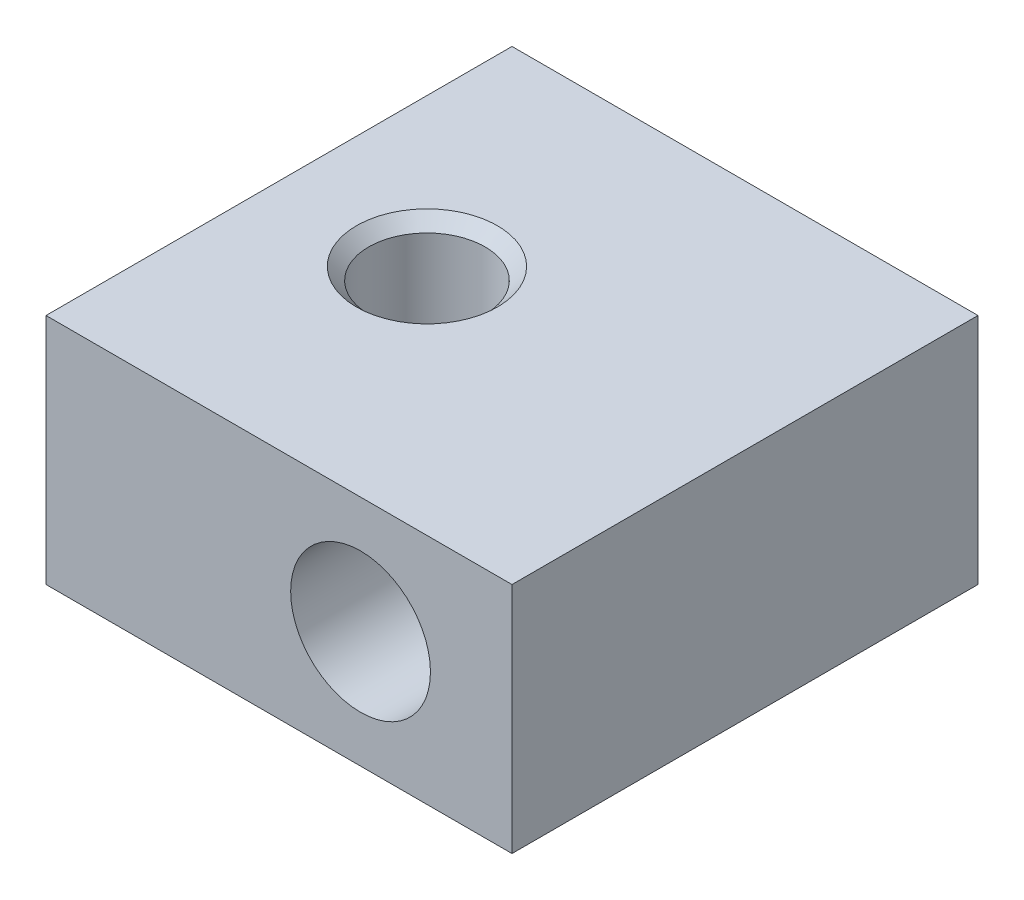
ISO-10303-21;
HEADER;
FILE_DESCRIPTION(('STEP AP214'),'2;1');
FILE_NAME('part.step','',(''),(''),'','','');
FILE_SCHEMA(('AUTOMOTIVE_DESIGN { 1 0 10303 214 1 1 1 1 }'));
ENDSEC;
DATA;
#1=APPLICATION_CONTEXT('core data for automotive mechanical design processes');
#2=APPLICATION_PROTOCOL_DEFINITION('international standard','automotive_design',2000,#1);
#3=PRODUCT_CONTEXT('',#1,'mechanical');
#4=PRODUCT('Part','Part','',(#3));
#5=PRODUCT_RELATED_PRODUCT_CATEGORY('part','',(#4));
#6=PRODUCT_DEFINITION_FORMATION('','',#4);
#7=PRODUCT_DEFINITION_CONTEXT('part definition',#1,'design');
#8=PRODUCT_DEFINITION('design','',#6,#7);
#9=PRODUCT_DEFINITION_SHAPE('','',#8);
#10=(LENGTH_UNIT() NAMED_UNIT(*) SI_UNIT(.MILLI.,.METRE.));
#11=(NAMED_UNIT(*) PLANE_ANGLE_UNIT() SI_UNIT($,.RADIAN.));
#12=(NAMED_UNIT(*) SI_UNIT($,.STERADIAN.) SOLID_ANGLE_UNIT());
#13=UNCERTAINTY_MEASURE_WITH_UNIT(LENGTH_MEASURE(1.E-05),#10,'distance_accuracy_value','');
#14=(GEOMETRIC_REPRESENTATION_CONTEXT(3) GLOBAL_UNCERTAINTY_ASSIGNED_CONTEXT((#13)) GLOBAL_UNIT_ASSIGNED_CONTEXT((#10,
#11,#12)) REPRESENTATION_CONTEXT('',''));
#15=CARTESIAN_POINT('',(0.,0.,0.));
#16=DIRECTION('',(0.,0.,1.));
#17=DIRECTION('',(1.,0.,0.));
#18=AXIS2_PLACEMENT_3D('',#15,#16,#17);
#19=CARTESIAN_POINT('',(-10.,5.,10.));
#20=DIRECTION('',(1.,0.,0.));
#21=DIRECTION('',(0.,0.,-1.));
#22=AXIS2_PLACEMENT_3D('',#19,#20,#21);
#23=PLANE('',#22);
#24=DIRECTION('',(0.,0.,1.));
#25=VECTOR('',#24,1.);
#26=CARTESIAN_POINT('',(-10.,-5.,10.));
#27=LINE('',#26,#25);
#28=CARTESIAN_POINT('',(-10.,-5.,-10.));
#29=VERTEX_POINT('',#28);
#30=CARTESIAN_POINT('',(-10.,-5.,10.));
#31=VERTEX_POINT('',#30);
#32=EDGE_CURVE('E116',#29,#31,#27,.T.);
#33=ORIENTED_EDGE('',*,*,#32,.T.);
#34=DIRECTION('',(0.,-1.,0.));
#35=VECTOR('',#34,1.);
#36=CARTESIAN_POINT('',(-10.,5.,10.));
#37=LINE('',#36,#35);
#38=CARTESIAN_POINT('',(-10.,5.,10.));
#39=VERTEX_POINT('',#38);
#40=EDGE_CURVE('E137',#39,#31,#37,.T.);
#41=ORIENTED_EDGE('',*,*,#40,.F.);
#42=DIRECTION('',(0.,0.,1.));
#43=VECTOR('',#42,1.);
#44=CARTESIAN_POINT('',(-10.,5.,10.));
#45=LINE('',#44,#43);
#46=CARTESIAN_POINT('',(-10.,5.,-10.));
#47=VERTEX_POINT('',#46);
#48=EDGE_CURVE('E117',#47,#39,#45,.T.);
#49=ORIENTED_EDGE('',*,*,#48,.F.);
#50=DIRECTION('',(0.,-1.,0.));
#51=VECTOR('',#50,1.);
#52=CARTESIAN_POINT('',(-10.,5.,-10.));
#53=LINE('',#52,#51);
#54=EDGE_CURVE('E123',#47,#29,#53,.T.);
#55=ORIENTED_EDGE('',*,*,#54,.T.);
#56=EDGE_LOOP('',(#33,#41,#49,#55));
#57=FACE_BOUND('',#56,.T.);
#58=ADVANCED_FACE('F17',(#57),#23,.F.);
#59=CARTESIAN_POINT('',(10.,5.,10.));
#60=DIRECTION('',(0.,0.,-1.));
#61=DIRECTION('',(-1.,0.,0.));
#62=AXIS2_PLACEMENT_3D('',#59,#60,#61);
#63=PLANE('',#62);
#64=CARTESIAN_POINT('',(3.5,0.,10.));
#65=DIRECTION('',(0.,0.,-1.));
#66=DIRECTION('',(-1.,0.,0.));
#67=AXIS2_PLACEMENT_3D('',#64,#65,#66);
#68=CIRCLE('',#67,3.);
#69=CARTESIAN_POINT('',(0.5,0.,10.));
#70=VERTEX_POINT('',#69);
#71=EDGE_CURVE('E104',#70,#70,#68,.T.);
#72=ORIENTED_EDGE('',*,*,#71,.T.);
#73=EDGE_LOOP('',(#72));
#74=FACE_BOUND('',#73,.T.);
#75=DIRECTION('',(1.,0.,0.));
#76=VECTOR('',#75,1.);
#77=CARTESIAN_POINT('',(10.,-5.,10.));
#78=LINE('',#77,#76);
#79=CARTESIAN_POINT('',(10.,-5.,10.));
#80=VERTEX_POINT('',#79);
#81=EDGE_CURVE('E126',#31,#80,#78,.T.);
#82=ORIENTED_EDGE('',*,*,#81,.T.);
#83=DIRECTION('',(0.,-1.,0.));
#84=VECTOR('',#83,1.);
#85=CARTESIAN_POINT('',(10.,5.,10.));
#86=LINE('',#85,#84);
#87=CARTESIAN_POINT('',(10.,5.,10.));
#88=VERTEX_POINT('',#87);
#89=EDGE_CURVE('E134',#88,#80,#86,.T.);
#90=ORIENTED_EDGE('',*,*,#89,.F.);
#91=DIRECTION('',(1.,0.,0.));
#92=VECTOR('',#91,1.);
#93=CARTESIAN_POINT('',(10.,5.,10.));
#94=LINE('',#93,#92);
#95=EDGE_CURVE('E69',#39,#88,#94,.T.);
#96=ORIENTED_EDGE('',*,*,#95,.F.);
#97=ORIENTED_EDGE('',*,*,#40,.T.);
#98=EDGE_LOOP('',(#82,#90,#96,#97));
#99=FACE_BOUND('',#98,.T.);
#100=ADVANCED_FACE('F154',(#74,#99),#63,.F.);
#101=CARTESIAN_POINT('',(10.,5.,10.));
#102=DIRECTION('',(-1.,0.,0.));
#103=DIRECTION('',(0.,0.,1.));
#104=AXIS2_PLACEMENT_3D('',#101,#102,#103);
#105=PLANE('',#104);
#106=DIRECTION('',(0.,0.,-1.));
#107=VECTOR('',#106,1.);
#108=CARTESIAN_POINT('',(10.,-5.,10.));
#109=LINE('',#108,#107);
#110=CARTESIAN_POINT('',(10.,-5.,-10.));
#111=VERTEX_POINT('',#110);
#112=EDGE_CURVE('E128',#80,#111,#109,.T.);
#113=ORIENTED_EDGE('',*,*,#112,.T.);
#114=DIRECTION('',(0.,-1.,0.));
#115=VECTOR('',#114,1.);
#116=CARTESIAN_POINT('',(10.,5.,-10.));
#117=LINE('',#116,#115);
#118=CARTESIAN_POINT('',(10.,5.,-10.));
#119=VERTEX_POINT('',#118);
#120=EDGE_CURVE('E132',#119,#111,#117,.T.);
#121=ORIENTED_EDGE('',*,*,#120,.F.);
#122=DIRECTION('',(0.,0.,-1.));
#123=VECTOR('',#122,1.);
#124=CARTESIAN_POINT('',(10.,5.,10.));
#125=LINE('',#124,#123);
#126=EDGE_CURVE('E120',#88,#119,#125,.T.);
#127=ORIENTED_EDGE('',*,*,#126,.F.);
#128=ORIENTED_EDGE('',*,*,#89,.T.);
#129=EDGE_LOOP('',(#113,#121,#127,#128));
#130=FACE_BOUND('',#129,.T.);
#131=ADVANCED_FACE('F158',(#130),#105,.F.);
#132=CARTESIAN_POINT('',(10.,5.,-10.));
#133=DIRECTION('',(0.,0.,1.));
#134=DIRECTION('',(1.,0.,0.));
#135=AXIS2_PLACEMENT_3D('',#132,#133,#134);
#136=PLANE('',#135);
#137=CARTESIAN_POINT('',(-6.5,-2.5,-10.));
#138=DIRECTION('',(0.,0.,1.));
#139=DIRECTION('',(1.,0.,0.));
#140=AXIS2_PLACEMENT_3D('',#137,#138,#139);
#141=CIRCLE('',#140,1.5);
#142=CARTESIAN_POINT('',(-5.,-2.5,-10.));
#143=VERTEX_POINT('',#142);
#144=EDGE_CURVE('E11',#143,#143,#141,.T.);
#145=ORIENTED_EDGE('',*,*,#144,.T.);
#146=EDGE_LOOP('',(#145));
#147=FACE_BOUND('',#146,.T.);
#148=CARTESIAN_POINT('',(-3.5,0.,-10.));
#149=DIRECTION('',(0.,0.,-1.));
#150=DIRECTION('',(-1.,0.,0.));
#151=AXIS2_PLACEMENT_3D('',#148,#149,#150);
#152=CIRCLE('',#151,1.525);
#153=CARTESIAN_POINT('',(-5.025,0.,-10.));
#154=VERTEX_POINT('',#153);
#155=EDGE_CURVE('E92',#154,#154,#152,.T.);
#156=ORIENTED_EDGE('',*,*,#155,.F.);
#157=EDGE_LOOP('',(#156));
#158=FACE_BOUND('',#157,.T.);
#159=CARTESIAN_POINT('',(3.5,0.,-10.));
#160=DIRECTION('',(0.,0.,1.));
#161=DIRECTION('',(1.,0.,0.));
#162=AXIS2_PLACEMENT_3D('',#159,#160,#161);
#163=CIRCLE('',#162,3.);
#164=CARTESIAN_POINT('',(6.5,0.,-10.));
#165=VERTEX_POINT('',#164);
#166=EDGE_CURVE('E101',#165,#165,#163,.T.);
#167=ORIENTED_EDGE('',*,*,#166,.T.);
#168=EDGE_LOOP('',(#167));
#169=FACE_BOUND('',#168,.T.);
#170=DIRECTION('',(-1.,0.,0.));
#171=VECTOR('',#170,1.);
#172=CARTESIAN_POINT('',(10.,-5.,-10.));
#173=LINE('',#172,#171);
#174=EDGE_CURVE('E61',#111,#29,#173,.T.);
#175=ORIENTED_EDGE('',*,*,#174,.T.);
#176=ORIENTED_EDGE('',*,*,#54,.F.);
#177=DIRECTION('',(-1.,0.,0.));
#178=VECTOR('',#177,1.);
#179=CARTESIAN_POINT('',(10.,5.,-10.));
#180=LINE('',#179,#178);
#181=EDGE_CURVE('E40',#119,#47,#180,.T.);
#182=ORIENTED_EDGE('',*,*,#181,.F.);
#183=ORIENTED_EDGE('',*,*,#120,.T.);
#184=EDGE_LOOP('',(#175,#176,#182,#183));
#185=FACE_BOUND('',#184,.T.);
#186=ADVANCED_FACE('F162',(#147,#158,#169,#185),#136,.F.);
#187=CARTESIAN_POINT('',(0.,5.,0.));
#188=DIRECTION('',(0.,1.,0.));
#189=DIRECTION('',(0.,0.,1.));
#190=AXIS2_PLACEMENT_3D('',#187,#188,#189);
#191=PLANE('',#190);
#192=CARTESIAN_POINT('',(-3.65,5.,0.));
#193=DIRECTION('',(0.,1.,0.));
#194=DIRECTION('',(0.,0.,1.));
#195=AXIS2_PLACEMENT_3D('',#192,#193,#194);
#196=CIRCLE('',#195,3.025);
#197=CARTESIAN_POINT('',(-3.65,5.,3.025));
#198=VERTEX_POINT('',#197);
#199=EDGE_CURVE('E107',#198,#198,#196,.T.);
#200=ORIENTED_EDGE('',*,*,#199,.F.);
#201=EDGE_LOOP('',(#200));
#202=FACE_BOUND('',#201,.T.);
#203=ORIENTED_EDGE('',*,*,#48,.T.);
#204=ORIENTED_EDGE('',*,*,#95,.T.);
#205=ORIENTED_EDGE('',*,*,#126,.T.);
#206=ORIENTED_EDGE('',*,*,#181,.T.);
#207=EDGE_LOOP('',(#203,#204,#205,#206));
#208=FACE_BOUND('',#207,.T.);
#209=ADVANCED_FACE('F166',(#202,#208),#191,.T.);
#210=CARTESIAN_POINT('',(0.,-5.,0.));
#211=DIRECTION('',(0.,1.,0.));
#212=DIRECTION('',(0.,0.,1.));
#213=AXIS2_PLACEMENT_3D('',#210,#211,#212);
#214=PLANE('',#213);
#215=CARTESIAN_POINT('',(3.5,-5.,0.));
#216=DIRECTION('',(0.,-1.,0.));
#217=DIRECTION('',(0.,0.,-1.));
#218=AXIS2_PLACEMENT_3D('',#215,#216,#217);
#219=CIRCLE('',#218,1.525);
#220=CARTESIAN_POINT('',(3.5,-5.,-1.525));
#221=VERTEX_POINT('',#220);
#222=EDGE_CURVE('E85',#221,#221,#219,.T.);
#223=ORIENTED_EDGE('',*,*,#222,.F.);
#224=EDGE_LOOP('',(#223));
#225=FACE_BOUND('',#224,.T.);
#226=CARTESIAN_POINT('',(-3.65,-5.,0.));
#227=DIRECTION('',(0.,1.,0.));
#228=DIRECTION('',(0.,0.,1.));
#229=AXIS2_PLACEMENT_3D('',#226,#227,#228);
#230=CIRCLE('',#229,2.5);
#231=CARTESIAN_POINT('',(-3.65,-5.,2.5));
#232=VERTEX_POINT('',#231);
#233=EDGE_CURVE('E113',#232,#232,#230,.T.);
#234=ORIENTED_EDGE('',*,*,#233,.T.);
#235=EDGE_LOOP('',(#234));
#236=FACE_BOUND('',#235,.T.);
#237=ORIENTED_EDGE('',*,*,#32,.F.);
#238=ORIENTED_EDGE('',*,*,#174,.F.);
#239=ORIENTED_EDGE('',*,*,#112,.F.);
#240=ORIENTED_EDGE('',*,*,#81,.F.);
#241=EDGE_LOOP('',(#237,#238,#239,#240));
#242=FACE_BOUND('',#241,.T.);
#243=ADVANCED_FACE('F168',(#225,#236,#242),#214,.F.);
#244=CARTESIAN_POINT('',(-3.65,5.,0.));
#245=DIRECTION('',(0.,1.,0.));
#246=DIRECTION('',(0.,0.,1.));
#247=AXIS2_PLACEMENT_3D('',#244,#245,#246);
#248=CYLINDRICAL_SURFACE('',#247,2.5);
#249=ORIENTED_EDGE('',*,*,#233,.F.);
#250=EDGE_LOOP('',(#249));
#251=FACE_BOUND('',#250,.T.);
#252=CARTESIAN_POINT('',(-3.65,4.475,0.));
#253=DIRECTION('',(0.,1.,0.));
#254=DIRECTION('',(0.,0.,1.));
#255=AXIS2_PLACEMENT_3D('',#252,#253,#254);
#256=CIRCLE('',#255,2.5);
#257=CARTESIAN_POINT('',(-3.65,4.475,2.5));
#258=VERTEX_POINT('',#257);
#259=EDGE_CURVE('E110',#258,#258,#256,.T.);
#260=ORIENTED_EDGE('',*,*,#259,.T.);
#261=EDGE_LOOP('',(#260));
#262=FACE_BOUND('',#261,.T.);
#263=ADVANCED_FACE('F171',(#251,#262),#248,.F.);
#264=CARTESIAN_POINT('',(-3.65,5.,0.));
#265=DIRECTION('',(0.,1.,0.));
#266=DIRECTION('',(0.,0.,1.));
#267=AXIS2_PLACEMENT_3D('',#264,#265,#266);
#268=CONICAL_SURFACE('',#267,3.025,0.785398163397448);
#269=ORIENTED_EDGE('',*,*,#259,.F.);
#270=EDGE_LOOP('',(#269));
#271=FACE_BOUND('',#270,.T.);
#272=ORIENTED_EDGE('',*,*,#199,.T.);
#273=EDGE_LOOP('',(#272));
#274=FACE_BOUND('',#273,.T.);
#275=ADVANCED_FACE('F177',(#271,#274),#268,.F.);
#276=CARTESIAN_POINT('',(3.5,0.,-10.));
#277=DIRECTION('',(0.,0.,1.));
#278=DIRECTION('',(1.,0.,0.));
#279=AXIS2_PLACEMENT_3D('',#276,#277,#278);
#280=CYLINDRICAL_SURFACE('',#279,3.);
#281=CARTESIAN_POINT('',(2.93902929634629,-2.94708534773474,-1.01754863024887));
#282=CARTESIAN_POINT('',(2.9778360711985,-2.95447222187118,-1.05298053926856));
#283=CARTESIAN_POINT('',(3.01938695038981,-2.96158871412183,-1.08556307139888));
#284=CARTESIAN_POINT('',(3.10761273509672,-2.97456074940779,-1.14330144718656));
#285=CARTESIAN_POINT('',(3.15428729096119,-2.98041637840655,-1.16845779719147));
#286=CARTESIAN_POINT('',(3.24167508543036,-2.9891096829254,-1.20519803350001));
#287=CARTESIAN_POINT('',(3.28161956267831,-2.99232129085835,-1.21851415452172));
#288=CARTESIAN_POINT('',(3.36322676214379,-2.99715830910277,-1.23844087267233));
#289=CARTESIAN_POINT('',(3.40488759593804,-2.99878541661862,-1.24505864489713));
#290=CARTESIAN_POINT('',(3.48888219520198,-3.00027410561686,-1.25111673260446));
#291=CARTESIAN_POINT('',(3.53121749172038,-3.00013083738701,-1.25053733235394));
#292=CARTESIAN_POINT('',(3.61513304261517,-2.99808402394393,-1.24219921613601));
#293=CARTESIAN_POINT('',(3.65671305429838,-2.99617992278466,-1.23443823273395));
#294=CARTESIAN_POINT('',(3.73660518678549,-2.99091472488166,-1.21267706898914));
#295=CARTESIAN_POINT('',(3.77497979996249,-2.98760358092684,-1.19889037371994));
#296=CARTESIAN_POINT('',(3.84920383108237,-2.9798409975681,-1.16594023589102));
#297=CARTESIAN_POINT('',(3.88505212026398,-2.97538905252149,-1.14677440875331));
#298=CARTESIAN_POINT('',(3.96795514299889,-2.96368351399748,-1.09508302399504));
#299=CARTESIAN_POINT('',(4.01355182189519,-2.95603086401605,-1.0603052290243));
#300=CARTESIAN_POINT('',(4.09841172060407,-2.9400302886856,-0.98384346727962));
#301=CARTESIAN_POINT('',(4.13766100752315,-2.93168089320182,-0.942144704173637));
#302=CARTESIAN_POINT('',(4.21969783319018,-2.91277659055338,-0.841248307860172));
#303=CARTESIAN_POINT('',(4.26046171194589,-2.90225036079277,-0.780400596432255));
#304=CARTESIAN_POINT('',(4.33157296350633,-2.88268054567367,-0.652731539629632));
#305=CARTESIAN_POINT('',(4.36191522522709,-2.87363768893975,-0.585907283362585));
#306=CARTESIAN_POINT('',(4.41248973831627,-2.85798399665081,-0.447391793872622));
#307=CARTESIAN_POINT('',(4.4326015874294,-2.85140235563737,-0.375653389612368));
#308=CARTESIAN_POINT('',(4.46206880576753,-2.84159545769912,-0.229816649741117));
#309=CARTESIAN_POINT('',(4.47142791308129,-2.83836903440172,-0.155719143461483));
#310=CARTESIAN_POINT('',(4.47966178285473,-2.83554057809487,-0.000147332350316075));
#311=CARTESIAN_POINT('',(4.47751501986915,-2.83629160878133,0.0813896512244588));
#312=CARTESIAN_POINT('',(4.46035320384701,-2.84214715036597,0.243005836637991));
#313=CARTESIAN_POINT('',(4.44532700724899,-2.84725543123167,0.323083714735451));
#314=CARTESIAN_POINT('',(4.402430970354,-2.86114105619701,0.479890506843587));
#315=CARTESIAN_POINT('',(4.37448816345345,-2.86993921809356,0.556597647252081));
#316=CARTESIAN_POINT('',(4.30580516377636,-2.88997522008667,0.703728792401274));
#317=CARTESIAN_POINT('',(4.26507680191878,-2.90121080179635,0.774158528797722));
#318=CARTESIAN_POINT('',(4.18359603275756,-2.92129088955439,0.887777220450764));
#319=CARTESIAN_POINT('',(4.14585768344327,-2.92995547582202,0.933167851533735));
#320=CARTESIAN_POINT('',(4.06355219277738,-2.94689127798536,1.01735255706188));
#321=CARTESIAN_POINT('',(4.01899685748788,-2.95516314217414,1.05615779599691));
#322=CARTESIAN_POINT('',(3.93351014765644,-2.96875761184617,1.11773853414662));
#323=CARTESIAN_POINT('',(3.89381521029807,-2.97433360816311,1.14216821307014));
#324=CARTESIAN_POINT('',(3.81084464027,-2.98414392405744,1.18435387889734));
#325=CARTESIAN_POINT('',(3.76757141748897,-2.9883791374864,1.20211431342213));
#326=CARTESIAN_POINT('',(3.67803383858374,-2.99505098279065,1.2298215395183));
#327=CARTESIAN_POINT('',(3.63174839413767,-2.99747301277631,1.23970493613638));
#328=CARTESIAN_POINT('',(3.53808372771573,-3.00012292736946,1.25050949783587));
#329=CARTESIAN_POINT('',(3.49070528856136,-3.00035233628489,1.25143688912783));
#330=CARTESIAN_POINT('',(3.40269703498015,-2.99870346434794,1.24472357541363));
#331=CARTESIAN_POINT('',(3.36197492334633,-2.9970893967347,1.23815702342402));
#332=CARTESIAN_POINT('',(3.28219789443755,-2.99235022788011,1.21863332811204));
#333=CARTESIAN_POINT('',(3.24314323679922,-2.98922489224867,1.20567519348104));
#334=CARTESIAN_POINT('',(3.16645953018236,-2.98165715307274,1.17371102940515));
#335=CARTESIAN_POINT('',(3.128901100534,-2.97718029552198,1.15454569520127));
#336=CARTESIAN_POINT('',(3.05691146356344,-2.96732126665458,1.11124457377295));
#337=CARTESIAN_POINT('',(3.02248239040754,-2.96193848454259,1.08710543061175));
#338=CARTESIAN_POINT('',(2.94065479783533,-2.94781547782453,1.02166547657245));
#339=CARTESIAN_POINT('',(2.89535074447032,-2.93873958108735,0.977809510120208));
#340=CARTESIAN_POINT('',(2.81251334740614,-2.92047408783216,0.883304663569847));
#341=CARTESIAN_POINT('',(2.77499412845432,-2.9112843161556,0.832643706110888));
#342=CARTESIAN_POINT('',(2.70711297410587,-2.8935413922738,0.725364748146522));
#343=CARTESIAN_POINT('',(2.6768904577757,-2.88500249854355,0.668656699237461));
#344=CARTESIAN_POINT('',(2.62445276735147,-2.8695231273399,0.551498458079574));
#345=CARTESIAN_POINT('',(2.60223558787846,-2.86258224971259,0.491049207473657));
#346=CARTESIAN_POINT('',(2.5621278364162,-2.84972520368249,0.355028348082336));
#347=CARTESIAN_POINT('',(2.54602764086892,-2.84430207810282,0.278875505840074));
#348=CARTESIAN_POINT('',(2.52557831565073,-2.83736109499345,0.124830751655243));
#349=CARTESIAN_POINT('',(2.521232420561,-2.83584431242761,0.0469383669648343));
#350=CARTESIAN_POINT('',(2.52442641842971,-2.83694609416574,-0.11234339846762));
#351=CARTESIAN_POINT('',(2.53254901175766,-2.83976740472242,-0.193720466606233));
#352=CARTESIAN_POINT('',(2.56169692382507,-2.8495296904797,-0.354009290785076));
#353=CARTESIAN_POINT('',(2.58274176565249,-2.85647689861389,-0.432917126340754));
#354=CARTESIAN_POINT('',(2.63762927239481,-2.87352491336645,-0.585943130284061));
#355=CARTESIAN_POINT('',(2.67149414831118,-2.88363118781252,-0.660052723160632));
#356=CARTESIAN_POINT('',(2.75196452097804,-2.90554124908191,-0.800512814051278));
#357=CARTESIAN_POINT('',(2.79851248014999,-2.91733725838019,-0.866896465663934));
#358=CARTESIAN_POINT('',(2.86512419460127,-2.93208601956906,-0.943425439667884));
#359=CARTESIAN_POINT('',(2.87929234574696,-2.93512242332619,-0.958831225125948));
#360=CARTESIAN_POINT('',(2.90850403117792,-2.94114870533602,-0.988825848105447));
#361=CARTESIAN_POINT('',(2.92354831408762,-2.94413854094936,-1.00341396543805));
#362=CARTESIAN_POINT('',(2.93902929634629,-2.94708534773474,-1.01754863024887));
#363=B_SPLINE_CURVE_WITH_KNOTS('',3,(#281,#282,#283,#284,#285,#286,#287,#288,#289,#290,#291,
#292,#293,#294,#295,#296,#297,#298,#299,#300,#301,#302,#303,#304,#305,#306,#307,#308,#309,#310,
#311,#312,#313,#314,#315,#316,#317,#318,#319,#320,#321,#322,#323,#324,#325,#326,#327,#328,#329,
#330,#331,#332,#333,#334,#335,#336,#337,#338,#339,#340,#341,#342,#343,#344,#345,#346,#347,#348,
#349,#350,#351,#352,#353,#354,#355,#356,#357,#358,#359,#360,#361,#362),.UNSPECIFIED.,.T.,.F.,(4,
2,2,2,2,2,2,2,2,2,2,2,2,2,2,2,2,2,2,2,2,2,2,2,2,2,2,2,2,2,2,2,2,2,2,2,2,2,2,2,4),(0.,
0.15912411277659,0.318237373311216,0.444380918795679,0.570389199160606,0.696742739034258,
0.823136186011441,0.945374754221231,1.06766759681215,1.24027883088121,1.41326395943052,
1.6340917608268,1.85502770889539,2.07850696271373,2.30190850255771,2.54545519881137,
2.78921282983248,3.03436461205284,3.27929021216189,3.45765934701493,3.63572299698421,
3.77601125063109,3.91620578124798,4.05751752479612,4.19873102141099,4.32199408896755,
4.44527628014172,4.57201321921165,4.69883595211714,4.88890375891623,5.07931346460491,
5.2731154184368,5.46686879005361,5.69990366262878,5.9330026558689,6.17733150462378,
6.42203039968795,6.66715519591707,6.91118596908313,6.97460950127746,7.03808804532561),.UNSPECIFIED.);
#364=CARTESIAN_POINT('',(3.5,-3.,1.25));
#365=VERTEX_POINT('',#364);
#366=CARTESIAN_POINT('',(3.5,-3.,-1.25));
#367=VERTEX_POINT('',#366);
#368=EDGE_CURVE('E139',#365,#367,#363,.T.);
#369=ORIENTED_EDGE('',*,*,#368,.T.);
#370=EDGE_CURVE('E145',#367,#365,#363,.T.);
#371=ORIENTED_EDGE('',*,*,#370,.T.);
#372=EDGE_LOOP('',(#369,#371));
#373=FACE_BOUND('',#372,.T.);
#374=ORIENTED_EDGE('',*,*,#166,.F.);
#375=EDGE_LOOP('',(#374));
#376=FACE_BOUND('',#375,.T.);
#377=ORIENTED_EDGE('',*,*,#71,.F.);
#378=EDGE_LOOP('',(#377));
#379=FACE_BOUND('',#378,.T.);
#380=ADVANCED_FACE('F146',(#373,#376,#379),#280,.F.);
#381=CARTESIAN_POINT('',(3.5,-3.,0.));
#382=DIRECTION('',(0.,-1.,0.));
#383=DIRECTION('',(0.,0.,-1.));
#384=AXIS2_PLACEMENT_3D('',#381,#382,#383);
#385=CONICAL_SURFACE('',#384,1.25,1.02974425867665);
#386=CARTESIAN_POINT('',(3.5,-3.,0.));
#387=DIRECTION('',(0.,-1.,0.));
#388=DIRECTION('',(0.,0.,-1.));
#389=AXIS2_PLACEMENT_3D('',#386,#387,#388);
#390=CIRCLE('',#389,1.25);
#391=EDGE_CURVE('E98',#367,#365,#390,.T.);
#392=ORIENTED_EDGE('',*,*,#391,.T.);
#393=ORIENTED_EDGE('',*,*,#370,.F.);
#394=EDGE_LOOP('',(#392,#393));
#395=FACE_BOUND('',#394,.T.);
#396=ADVANCED_FACE('F187',(#395),#385,.F.);
#397=EDGE_CURVE('E31',#365,#367,#390,.T.);
#398=ORIENTED_EDGE('',*,*,#397,.T.);
#399=ORIENTED_EDGE('',*,*,#368,.F.);
#400=EDGE_LOOP('',(#398,#399));
#401=FACE_BOUND('',#400,.T.);
#402=ADVANCED_FACE('F204',(#401),#385,.F.);
#403=CARTESIAN_POINT('',(3.5,-5.,0.));
#404=DIRECTION('',(0.,-1.,0.));
#405=DIRECTION('',(0.,0.,-1.));
#406=AXIS2_PLACEMENT_3D('',#403,#404,#405);
#407=CYLINDRICAL_SURFACE('',#406,1.25);
#408=ORIENTED_EDGE('',*,*,#391,.F.);
#409=ORIENTED_EDGE('',*,*,#397,.F.);
#410=EDGE_LOOP('',(#408,#409));
#411=FACE_BOUND('',#410,.T.);
#412=CARTESIAN_POINT('',(3.5,-4.725,0.));
#413=DIRECTION('',(0.,-1.,0.));
#414=DIRECTION('',(0.,0.,-1.));
#415=AXIS2_PLACEMENT_3D('',#412,#413,#414);
#416=CIRCLE('',#415,1.25);
#417=CARTESIAN_POINT('',(3.5,-4.725,-1.25));
#418=VERTEX_POINT('',#417);
#419=EDGE_CURVE('E89',#418,#418,#416,.T.);
#420=ORIENTED_EDGE('',*,*,#419,.T.);
#421=EDGE_LOOP('',(#420));
#422=FACE_BOUND('',#421,.T.);
#423=ADVANCED_FACE('F214',(#411,#422),#407,.F.);
#424=CARTESIAN_POINT('',(3.5,-5.,0.));
#425=DIRECTION('',(0.,-1.,0.));
#426=DIRECTION('',(0.,0.,-1.));
#427=AXIS2_PLACEMENT_3D('',#424,#425,#426);
#428=CONICAL_SURFACE('',#427,1.525,0.785398163397448);
#429=ORIENTED_EDGE('',*,*,#419,.F.);
#430=EDGE_LOOP('',(#429));
#431=FACE_BOUND('',#430,.T.);
#432=ORIENTED_EDGE('',*,*,#222,.T.);
#433=EDGE_LOOP('',(#432));
#434=FACE_BOUND('',#433,.T.);
#435=ADVANCED_FACE('F79',(#431,#434),#428,.F.);
#436=CARTESIAN_POINT('',(-3.5,0.,-5.));
#437=DIRECTION('',(0.,0.,-1.));
#438=DIRECTION('',(-1.,0.,0.));
#439=AXIS2_PLACEMENT_3D('',#436,#437,#438);
#440=CONICAL_SURFACE('',#439,1.25,1.02974425867665);
#441=CARTESIAN_POINT('',(-3.5,0.,-4.24892422621556));
#442=VERTEX_POINT('',#441);
#443=VERTEX_LOOP('',#442);
#444=FACE_BOUND('',#443,.T.);
#445=CARTESIAN_POINT('',(-3.5,0.,-5.));
#446=DIRECTION('',(0.,0.,-1.));
#447=DIRECTION('',(-1.,0.,0.));
#448=AXIS2_PLACEMENT_3D('',#445,#446,#447);
#449=CIRCLE('',#448,1.25);
#450=CARTESIAN_POINT('',(-4.75,0.,-5.));
#451=VERTEX_POINT('',#450);
#452=EDGE_CURVE('E83',#451,#451,#449,.T.);
#453=ORIENTED_EDGE('',*,*,#452,.T.);
#454=EDGE_LOOP('',(#453));
#455=FACE_BOUND('',#454,.T.);
#456=ADVANCED_FACE('F75',(#444,#455),#440,.F.);
#457=CARTESIAN_POINT('',(-3.5,0.,-10.));
#458=DIRECTION('',(0.,0.,-1.));
#459=DIRECTION('',(-1.,0.,0.));
#460=AXIS2_PLACEMENT_3D('',#457,#458,#459);
#461=CYLINDRICAL_SURFACE('',#460,1.25);
#462=ORIENTED_EDGE('',*,*,#452,.F.);
#463=EDGE_LOOP('',(#462));
#464=FACE_BOUND('',#463,.T.);
#465=CARTESIAN_POINT('',(-3.5,0.,-9.725));
#466=DIRECTION('',(0.,0.,-1.));
#467=DIRECTION('',(-1.,0.,0.));
#468=AXIS2_PLACEMENT_3D('',#465,#466,#467);
#469=CIRCLE('',#468,1.25);
#470=CARTESIAN_POINT('',(-4.75,0.,-9.725));
#471=VERTEX_POINT('',#470);
#472=EDGE_CURVE('E86',#471,#471,#469,.T.);
#473=ORIENTED_EDGE('',*,*,#472,.T.);
#474=EDGE_LOOP('',(#473));
#475=FACE_BOUND('',#474,.T.);
#476=ADVANCED_FACE('F78',(#464,#475),#461,.F.);
#477=CARTESIAN_POINT('',(-3.5,0.,-10.));
#478=DIRECTION('',(0.,0.,-1.));
#479=DIRECTION('',(-1.,0.,0.));
#480=AXIS2_PLACEMENT_3D('',#477,#478,#479);
#481=CONICAL_SURFACE('',#480,1.525,0.78539816339747);
#482=ORIENTED_EDGE('',*,*,#472,.F.);
#483=EDGE_LOOP('',(#482));
#484=FACE_BOUND('',#483,.T.);
#485=ORIENTED_EDGE('',*,*,#155,.T.);
#486=EDGE_LOOP('',(#485));
#487=FACE_BOUND('',#486,.T.);
#488=ADVANCED_FACE('F241',(#484,#487),#481,.F.);
#489=CARTESIAN_POINT('',(-6.5,-2.5,-4.));
#490=DIRECTION('',(0.,0.,-1.));
#491=DIRECTION('',(-1.,0.,0.));
#492=AXIS2_PLACEMENT_3D('',#489,#490,#491);
#493=CYLINDRICAL_SURFACE('',#492,1.);
#494=CARTESIAN_POINT('',(-6.5,-2.5,-9.5));
#495=DIRECTION('',(0.,0.,1.));
#496=DIRECTION('',(1.,0.,0.));
#497=AXIS2_PLACEMENT_3D('',#494,#495,#496);
#498=CIRCLE('',#497,1.);
#499=CARTESIAN_POINT('',(-5.5,-2.5,-9.5));
#500=VERTEX_POINT('',#499);
#501=EDGE_CURVE('E25',#500,#500,#498,.F.);
#502=ORIENTED_EDGE('',*,*,#501,.T.);
#503=EDGE_LOOP('',(#502));
#504=FACE_BOUND('',#503,.T.);
#505=CARTESIAN_POINT('',(-6.5,-2.5,-4.));
#506=DIRECTION('',(0.,0.,-1.));
#507=DIRECTION('',(-1.,0.,0.));
#508=AXIS2_PLACEMENT_3D('',#505,#506,#507);
#509=CIRCLE('',#508,1.);
#510=CARTESIAN_POINT('',(-7.5,-2.5,-4.));
#511=VERTEX_POINT('',#510);
#512=EDGE_CURVE('E236',#511,#511,#509,.T.);
#513=ORIENTED_EDGE('',*,*,#512,.F.);
#514=EDGE_LOOP('',(#513));
#515=FACE_BOUND('',#514,.T.);
#516=ADVANCED_FACE('F219',(#504,#515),#493,.F.);
#517=CARTESIAN_POINT('',(-6.5,-2.5,-4.));
#518=DIRECTION('',(0.,0.,-1.));
#519=DIRECTION('',(-1.,0.,0.));
#520=AXIS2_PLACEMENT_3D('',#517,#518,#519);
#521=PLANE('',#520);
#522=ORIENTED_EDGE('',*,*,#512,.T.);
#523=EDGE_LOOP('',(#522));
#524=FACE_BOUND('',#523,.T.);
#525=ADVANCED_FACE('F223',(#524),#521,.T.);
#526=CARTESIAN_POINT('',(-6.5,-2.5,-9.5));
#527=DIRECTION('',(0.,0.,-1.));
#528=DIRECTION('',(-1.,0.,0.));
#529=AXIS2_PLACEMENT_3D('',#526,#527,#528);
#530=CONICAL_SURFACE('',#529,1.,0.785398163397451);
#531=ORIENTED_EDGE('',*,*,#144,.F.);
#532=EDGE_LOOP('',(#531));
#533=FACE_BOUND('',#532,.T.);
#534=ORIENTED_EDGE('',*,*,#501,.F.);
#535=EDGE_LOOP('',(#534));
#536=FACE_BOUND('',#535,.T.);
#537=ADVANCED_FACE('F19',(#533,#536),#530,.F.);
#538=CLOSED_SHELL('',(#58,#100,#131,#186,#209,#243,#263,#275,#380,#396,#402,#423,#435,#456,#476,
#488,#516,#525,#537));
#539=MANIFOLD_SOLID_BREP('B1',#538);
#540=ADVANCED_BREP_SHAPE_REPRESENTATION('',(#18,#539),#14);
#541=SHAPE_DEFINITION_REPRESENTATION(#9,#540);
ENDSEC;
END-ISO-10303-21;
